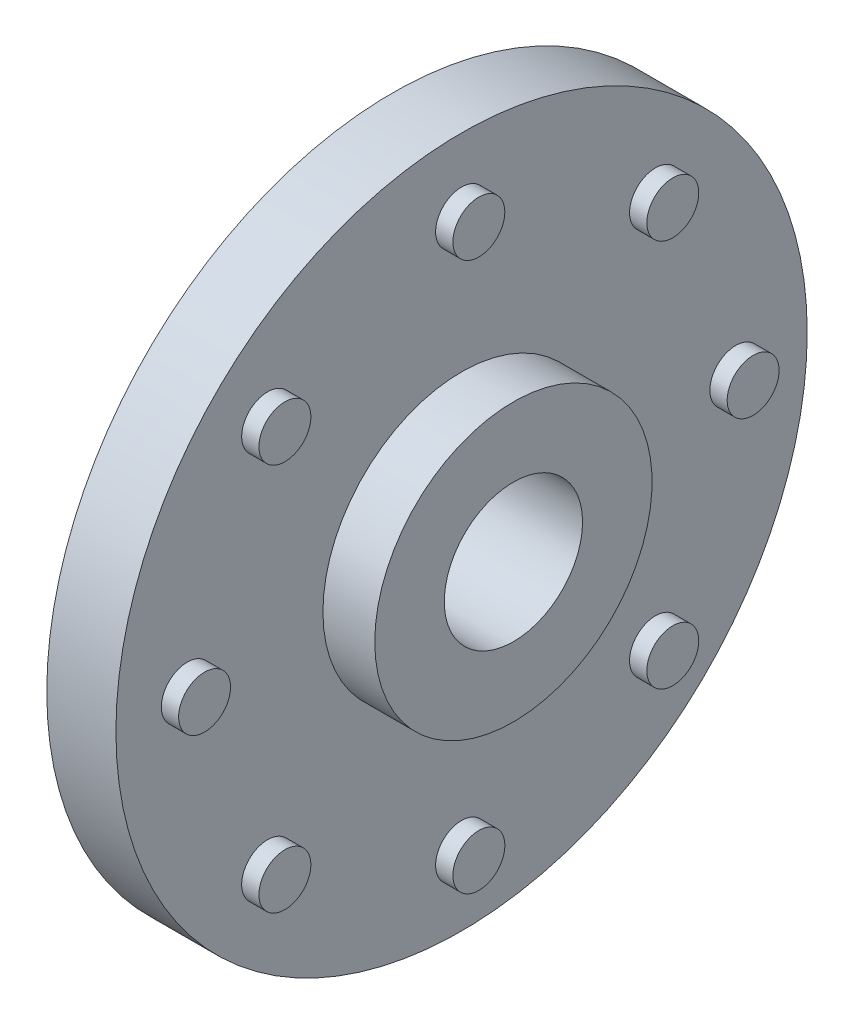
ISO-10303-21;
HEADER;
FILE_DESCRIPTION(('STEP AP214'),'2;1');
FILE_NAME('part.step','',(''),(''),'','','');
FILE_SCHEMA(('AUTOMOTIVE_DESIGN { 1 0 10303 214 1 1 1 1 }'));
ENDSEC;
DATA;
#1=APPLICATION_CONTEXT('core data for automotive mechanical design processes');
#2=APPLICATION_PROTOCOL_DEFINITION('international standard','automotive_design',2000,#1);
#3=PRODUCT_CONTEXT('',#1,'mechanical');
#4=PRODUCT('Part','Part','',(#3));
#5=PRODUCT_RELATED_PRODUCT_CATEGORY('part','',(#4));
#6=PRODUCT_DEFINITION_FORMATION('','',#4);
#7=PRODUCT_DEFINITION_CONTEXT('part definition',#1,'design');
#8=PRODUCT_DEFINITION('design','',#6,#7);
#9=PRODUCT_DEFINITION_SHAPE('','',#8);
#10=(LENGTH_UNIT() NAMED_UNIT(*) SI_UNIT(.MILLI.,.METRE.));
#11=(NAMED_UNIT(*) PLANE_ANGLE_UNIT() SI_UNIT($,.RADIAN.));
#12=(NAMED_UNIT(*) SI_UNIT($,.STERADIAN.) SOLID_ANGLE_UNIT());
#13=UNCERTAINTY_MEASURE_WITH_UNIT(LENGTH_MEASURE(1.E-05),#10,'distance_accuracy_value','');
#14=(GEOMETRIC_REPRESENTATION_CONTEXT(3) GLOBAL_UNCERTAINTY_ASSIGNED_CONTEXT((#13)) GLOBAL_UNIT_ASSIGNED_CONTEXT((#10,
#11,#12)) REPRESENTATION_CONTEXT('',''));
#15=CARTESIAN_POINT('',(0.,0.,0.));
#16=DIRECTION('',(0.,0.,1.));
#17=DIRECTION('',(1.,0.,0.));
#18=AXIS2_PLACEMENT_3D('',#15,#16,#17);
#19=CARTESIAN_POINT('',(25.4,0.,0.));
#20=DIRECTION('',(-1.,0.,0.));
#21=DIRECTION('',(0.,0.,1.));
#22=AXIS2_PLACEMENT_3D('',#19,#20,#21);
#23=CYLINDRICAL_SURFACE('',#22,127.);
#24=CARTESIAN_POINT('',(25.4,0.,0.));
#25=DIRECTION('',(1.,0.,0.));
#26=DIRECTION('',(0.,0.,-1.));
#27=AXIS2_PLACEMENT_3D('',#24,#25,#26);
#28=CIRCLE('',#27,127.);
#29=CARTESIAN_POINT('',(25.4,0.,-127.));
#30=VERTEX_POINT('',#29);
#31=EDGE_CURVE('E10',#30,#30,#28,.T.);
#32=ORIENTED_EDGE('',*,*,#31,.F.);
#33=EDGE_LOOP('',(#32));
#34=FACE_BOUND('',#33,.T.);
#35=CARTESIAN_POINT('',(0.,0.,0.));
#36=DIRECTION('',(1.,0.,0.));
#37=DIRECTION('',(0.,0.,-1.));
#38=AXIS2_PLACEMENT_3D('',#35,#36,#37);
#39=CIRCLE('',#38,127.);
#40=CARTESIAN_POINT('',(0.,0.,-127.));
#41=VERTEX_POINT('',#40);
#42=EDGE_CURVE('E42',#41,#41,#39,.T.);
#43=ORIENTED_EDGE('',*,*,#42,.T.);
#44=EDGE_LOOP('',(#43));
#45=FACE_BOUND('',#44,.T.);
#46=ADVANCED_FACE('F39',(#34,#45),#23,.T.);
#47=CARTESIAN_POINT('',(25.4,0.,0.));
#48=DIRECTION('',(1.,0.,0.));
#49=DIRECTION('',(0.,0.,-1.));
#50=AXIS2_PLACEMENT_3D('',#47,#48,#49);
#51=PLANE('',#50);
#52=CARTESIAN_POINT('',(25.4,0.,0.));
#53=DIRECTION('',(1.,0.,0.));
#54=DIRECTION('',(0.,0.,-1.));
#55=AXIS2_PLACEMENT_3D('',#52,#53,#54);
#56=CIRCLE('',#55,50.9441651055059);
#57=CARTESIAN_POINT('',(25.4,0.,50.9441651055059));
#58=VERTEX_POINT('',#57);
#59=EDGE_CURVE('E117',#58,#58,#56,.T.);
#60=ORIENTED_EDGE('',*,*,#59,.F.);
#61=EDGE_LOOP('',(#60));
#62=FACE_BOUND('',#61,.T.);
#63=CARTESIAN_POINT('',(25.4,70.6916974067853,-71.2605453901568));
#64=DIRECTION('',(1.,0.,0.));
#65=DIRECTION('',(0.,-0.707106781186539,-0.707106781186556));
#66=AXIS2_PLACEMENT_3D('',#63,#64,#65);
#67=CIRCLE('',#66,9.5415682804479);
#68=CARTESIAN_POINT('',(25.4,63.9447897725262,-78.007453024416));
#69=VERTEX_POINT('',#68);
#70=EDGE_CURVE('E109',#69,#69,#67,.T.);
#71=ORIENTED_EDGE('',*,*,#70,.F.);
#72=EDGE_LOOP('',(#71));
#73=FACE_BOUND('',#72,.T.);
#74=CARTESIAN_POINT('',(25.4,-0.568847983372097,-100.777629752864));
#75=DIRECTION('',(1.,0.,0.));
#76=DIRECTION('',(0.,-1.,0.));
#77=AXIS2_PLACEMENT_3D('',#74,#75,#76);
#78=CIRCLE('',#77,9.5415682804479);
#79=CARTESIAN_POINT('',(25.4,-10.11041626382,-100.777629752865));
#80=VERTEX_POINT('',#79);
#81=EDGE_CURVE('E101',#80,#80,#78,.T.);
#82=ORIENTED_EDGE('',*,*,#81,.F.);
#83=EDGE_LOOP('',(#82));
#84=FACE_BOUND('',#83,.T.);
#85=CARTESIAN_POINT('',(25.4,-71.8293933735302,-71.2605453901583));
#86=DIRECTION('',(1.,0.,0.));
#87=DIRECTION('',(0.,-0.707106781186554,0.707106781186541));
#88=AXIS2_PLACEMENT_3D('',#85,#86,#87);
#89=CIRCLE('',#88,9.5415682804479);
#90=CARTESIAN_POINT('',(25.4,-78.5763010077894,-64.5136377558992));
#91=VERTEX_POINT('',#90);
#92=EDGE_CURVE('E93',#91,#91,#89,.T.);
#93=ORIENTED_EDGE('',*,*,#92,.F.);
#94=EDGE_LOOP('',(#93));
#95=FACE_BOUND('',#94,.T.);
#96=CARTESIAN_POINT('',(25.4,-101.346477736238,0.));
#97=DIRECTION('',(1.,0.,0.));
#98=DIRECTION('',(0.,0.,1.));
#99=AXIS2_PLACEMENT_3D('',#96,#97,#98);
#100=CIRCLE('',#99,9.5415682804479);
#101=CARTESIAN_POINT('',(25.4,-101.346477736238,9.54156828044787));
#102=VERTEX_POINT('',#101);
#103=EDGE_CURVE('E85',#102,#102,#100,.T.);
#104=ORIENTED_EDGE('',*,*,#103,.F.);
#105=EDGE_LOOP('',(#104));
#106=FACE_BOUND('',#105,.T.);
#107=CARTESIAN_POINT('',(25.4,-71.8293933735312,71.2605453901572));
#108=DIRECTION('',(1.,0.,0.));
#109=DIRECTION('',(0.,0.707106781186544,0.707106781186551));
#110=AXIS2_PLACEMENT_3D('',#107,#108,#109);
#111=CIRCLE('',#110,9.5415682804479);
#112=CARTESIAN_POINT('',(25.4,-65.082485739272,78.0074530244164));
#113=VERTEX_POINT('',#112);
#114=EDGE_CURVE('E77',#113,#113,#111,.T.);
#115=ORIENTED_EDGE('',*,*,#114,.F.);
#116=EDGE_LOOP('',(#115));
#117=FACE_BOUND('',#116,.T.);
#118=CARTESIAN_POINT('',(25.4,-0.568847983373539,100.777629752864));
#119=DIRECTION('',(1.,0.,0.));
#120=DIRECTION('',(0.,1.,0.));
#121=AXIS2_PLACEMENT_3D('',#118,#119,#120);
#122=CIRCLE('',#121,9.5415682804479);
#123=CARTESIAN_POINT('',(25.4,8.97272029707437,100.777629752864));
#124=VERTEX_POINT('',#123);
#125=EDGE_CURVE('E69',#124,#124,#122,.T.);
#126=ORIENTED_EDGE('',*,*,#125,.F.);
#127=EDGE_LOOP('',(#126));
#128=FACE_BOUND('',#127,.T.);
#129=CARTESIAN_POINT('',(25.4,70.6916974067843,71.2605453901577));
#130=DIRECTION('',(1.,0.,0.));
#131=DIRECTION('',(0.,0.707106781186549,-0.707106781186546));
#132=AXIS2_PLACEMENT_3D('',#129,#130,#131);
#133=CIRCLE('',#132,9.5415682804479);
#134=CARTESIAN_POINT('',(25.4,77.4386050410435,64.5136377558986));
#135=VERTEX_POINT('',#134);
#136=EDGE_CURVE('E61',#135,#135,#133,.T.);
#137=ORIENTED_EDGE('',*,*,#136,.F.);
#138=EDGE_LOOP('',(#137));
#139=FACE_BOUND('',#138,.T.);
#140=CARTESIAN_POINT('',(25.4,100.208781769491,0.));
#141=DIRECTION('',(1.,0.,0.));
#142=DIRECTION('',(0.,0.,-1.));
#143=AXIS2_PLACEMENT_3D('',#140,#141,#142);
#144=CIRCLE('',#143,9.5415682804479);
#145=CARTESIAN_POINT('',(25.4,100.208781769491,-9.5415682804479));
#146=VERTEX_POINT('',#145);
#147=EDGE_CURVE('E53',#146,#146,#144,.T.);
#148=ORIENTED_EDGE('',*,*,#147,.F.);
#149=EDGE_LOOP('',(#148));
#150=FACE_BOUND('',#149,.T.);
#151=ORIENTED_EDGE('',*,*,#31,.T.);
#152=EDGE_LOOP('',(#151));
#153=FACE_BOUND('',#152,.T.);
#154=ADVANCED_FACE('F149',(#62,#73,#84,#95,#106,#117,#128,#139,#150,#153),#51,.T.);
#155=CARTESIAN_POINT('',(0.,0.,0.));
#156=DIRECTION('',(1.,0.,0.));
#157=DIRECTION('',(0.,0.,-1.));
#158=AXIS2_PLACEMENT_3D('',#155,#156,#157);
#159=PLANE('',#158);
#160=CARTESIAN_POINT('',(0.,0.,0.));
#161=DIRECTION('',(1.,0.,0.));
#162=DIRECTION('',(0.,0.,-1.));
#163=AXIS2_PLACEMENT_3D('',#160,#161,#162);
#164=CIRCLE('',#163,25.4);
#165=CARTESIAN_POINT('',(0.,0.,-25.4));
#166=VERTEX_POINT('',#165);
#167=EDGE_CURVE('E121',#166,#166,#164,.T.);
#168=ORIENTED_EDGE('',*,*,#167,.T.);
#169=EDGE_LOOP('',(#168));
#170=FACE_BOUND('',#169,.T.);
#171=ORIENTED_EDGE('',*,*,#42,.F.);
#172=EDGE_LOOP('',(#171));
#173=FACE_BOUND('',#172,.T.);
#174=ADVANCED_FACE('F152',(#170,#173),#159,.F.);
#175=CARTESIAN_POINT('',(31.75,100.208781769491,0.));
#176=DIRECTION('',(-1.,0.,0.));
#177=DIRECTION('',(0.,0.,1.));
#178=AXIS2_PLACEMENT_3D('',#175,#176,#177);
#179=CYLINDRICAL_SURFACE('',#178,9.5415682804479);
#180=CARTESIAN_POINT('',(31.75,100.208781769491,0.));
#181=DIRECTION('',(1.,0.,0.));
#182=DIRECTION('',(0.,0.,-1.));
#183=AXIS2_PLACEMENT_3D('',#180,#181,#182);
#184=CIRCLE('',#183,9.5415682804479);
#185=CARTESIAN_POINT('',(31.75,100.208781769491,-9.5415682804479));
#186=VERTEX_POINT('',#185);
#187=EDGE_CURVE('E51',#186,#186,#184,.T.);
#188=ORIENTED_EDGE('',*,*,#187,.F.);
#189=EDGE_LOOP('',(#188));
#190=FACE_BOUND('',#189,.T.);
#191=ORIENTED_EDGE('',*,*,#147,.T.);
#192=EDGE_LOOP('',(#191));
#193=FACE_BOUND('',#192,.T.);
#194=ADVANCED_FACE('F170',(#190,#193),#179,.T.);
#195=CARTESIAN_POINT('',(31.75,100.208781769491,0.));
#196=DIRECTION('',(1.,0.,0.));
#197=DIRECTION('',(0.,0.,-1.));
#198=AXIS2_PLACEMENT_3D('',#195,#196,#197);
#199=PLANE('',#198);
#200=ORIENTED_EDGE('',*,*,#187,.T.);
#201=EDGE_LOOP('',(#200));
#202=FACE_BOUND('',#201,.T.);
#203=ADVANCED_FACE('F172',(#202),#199,.T.);
#204=CARTESIAN_POINT('',(31.75,70.6916974067843,71.2605453901577));
#205=DIRECTION('',(-1.,0.,0.));
#206=DIRECTION('',(0.,0.,1.));
#207=AXIS2_PLACEMENT_3D('',#204,#205,#206);
#208=CYLINDRICAL_SURFACE('',#207,9.5415682804479);
#209=CARTESIAN_POINT('',(31.75,70.6916974067843,71.2605453901577));
#210=DIRECTION('',(1.,0.,0.));
#211=DIRECTION('',(0.,0.707106781186549,-0.707106781186546));
#212=AXIS2_PLACEMENT_3D('',#209,#210,#211);
#213=CIRCLE('',#212,9.5415682804479);
#214=CARTESIAN_POINT('',(31.75,77.4386050410435,64.5136377558986));
#215=VERTEX_POINT('',#214);
#216=EDGE_CURVE('E57',#215,#215,#213,.T.);
#217=ORIENTED_EDGE('',*,*,#216,.F.);
#218=EDGE_LOOP('',(#217));
#219=FACE_BOUND('',#218,.T.);
#220=ORIENTED_EDGE('',*,*,#136,.T.);
#221=EDGE_LOOP('',(#220));
#222=FACE_BOUND('',#221,.T.);
#223=ADVANCED_FACE('F179',(#219,#222),#208,.T.);
#224=CARTESIAN_POINT('',(31.75,70.6916974067843,71.2605453901577));
#225=DIRECTION('',(1.,0.,0.));
#226=DIRECTION('',(0.,0.707106781186549,-0.707106781186546));
#227=AXIS2_PLACEMENT_3D('',#224,#225,#226);
#228=PLANE('',#227);
#229=ORIENTED_EDGE('',*,*,#216,.T.);
#230=EDGE_LOOP('',(#229));
#231=FACE_BOUND('',#230,.T.);
#232=ADVANCED_FACE('F269',(#231),#228,.T.);
#233=CARTESIAN_POINT('',(31.75,-0.568847983373539,100.777629752864));
#234=DIRECTION('',(-1.,0.,0.));
#235=DIRECTION('',(0.,0.,1.));
#236=AXIS2_PLACEMENT_3D('',#233,#234,#235);
#237=CYLINDRICAL_SURFACE('',#236,9.5415682804479);
#238=CARTESIAN_POINT('',(31.75,-0.568847983373539,100.777629752864));
#239=DIRECTION('',(1.,0.,0.));
#240=DIRECTION('',(0.,1.,0.));
#241=AXIS2_PLACEMENT_3D('',#238,#239,#240);
#242=CIRCLE('',#241,9.5415682804479);
#243=CARTESIAN_POINT('',(31.75,8.97272029707437,100.777629752864));
#244=VERTEX_POINT('',#243);
#245=EDGE_CURVE('E65',#244,#244,#242,.T.);
#246=ORIENTED_EDGE('',*,*,#245,.F.);
#247=EDGE_LOOP('',(#246));
#248=FACE_BOUND('',#247,.T.);
#249=ORIENTED_EDGE('',*,*,#125,.T.);
#250=EDGE_LOOP('',(#249));
#251=FACE_BOUND('',#250,.T.);
#252=ADVANCED_FACE('F265',(#248,#251),#237,.T.);
#253=CARTESIAN_POINT('',(31.75,-0.568847983373539,100.777629752864));
#254=DIRECTION('',(1.,0.,0.));
#255=DIRECTION('',(0.,1.,0.));
#256=AXIS2_PLACEMENT_3D('',#253,#254,#255);
#257=PLANE('',#256);
#258=ORIENTED_EDGE('',*,*,#245,.T.);
#259=EDGE_LOOP('',(#258));
#260=FACE_BOUND('',#259,.T.);
#261=ADVANCED_FACE('F261',(#260),#257,.T.);
#262=CARTESIAN_POINT('',(31.75,-71.8293933735312,71.2605453901572));
#263=DIRECTION('',(-1.,0.,0.));
#264=DIRECTION('',(0.,0.,1.));
#265=AXIS2_PLACEMENT_3D('',#262,#263,#264);
#266=CYLINDRICAL_SURFACE('',#265,9.5415682804479);
#267=CARTESIAN_POINT('',(31.75,-71.8293933735312,71.2605453901572));
#268=DIRECTION('',(1.,0.,0.));
#269=DIRECTION('',(0.,0.707106781186544,0.707106781186551));
#270=AXIS2_PLACEMENT_3D('',#267,#268,#269);
#271=CIRCLE('',#270,9.5415682804479);
#272=CARTESIAN_POINT('',(31.75,-65.082485739272,78.0074530244164));
#273=VERTEX_POINT('',#272);
#274=EDGE_CURVE('E73',#273,#273,#271,.T.);
#275=ORIENTED_EDGE('',*,*,#274,.F.);
#276=EDGE_LOOP('',(#275));
#277=FACE_BOUND('',#276,.T.);
#278=ORIENTED_EDGE('',*,*,#114,.T.);
#279=EDGE_LOOP('',(#278));
#280=FACE_BOUND('',#279,.T.);
#281=ADVANCED_FACE('F257',(#277,#280),#266,.T.);
#282=CARTESIAN_POINT('',(31.75,-71.8293933735312,71.2605453901572));
#283=DIRECTION('',(1.,0.,0.));
#284=DIRECTION('',(0.,0.707106781186544,0.707106781186551));
#285=AXIS2_PLACEMENT_3D('',#282,#283,#284);
#286=PLANE('',#285);
#287=ORIENTED_EDGE('',*,*,#274,.T.);
#288=EDGE_LOOP('',(#287));
#289=FACE_BOUND('',#288,.T.);
#290=ADVANCED_FACE('F253',(#289),#286,.T.);
#291=CARTESIAN_POINT('',(31.75,-101.346477736238,0.));
#292=DIRECTION('',(-1.,0.,0.));
#293=DIRECTION('',(0.,0.,1.));
#294=AXIS2_PLACEMENT_3D('',#291,#292,#293);
#295=CYLINDRICAL_SURFACE('',#294,9.5415682804479);
#296=CARTESIAN_POINT('',(31.75,-101.346477736238,0.));
#297=DIRECTION('',(1.,0.,0.));
#298=DIRECTION('',(0.,0.,1.));
#299=AXIS2_PLACEMENT_3D('',#296,#297,#298);
#300=CIRCLE('',#299,9.5415682804479);
#301=CARTESIAN_POINT('',(31.75,-101.346477736238,9.54156828044787));
#302=VERTEX_POINT('',#301);
#303=EDGE_CURVE('E81',#302,#302,#300,.T.);
#304=ORIENTED_EDGE('',*,*,#303,.F.);
#305=EDGE_LOOP('',(#304));
#306=FACE_BOUND('',#305,.T.);
#307=ORIENTED_EDGE('',*,*,#103,.T.);
#308=EDGE_LOOP('',(#307));
#309=FACE_BOUND('',#308,.T.);
#310=ADVANCED_FACE('F249',(#306,#309),#295,.T.);
#311=CARTESIAN_POINT('',(31.75,-101.346477736238,0.));
#312=DIRECTION('',(1.,0.,0.));
#313=DIRECTION('',(0.,0.,1.));
#314=AXIS2_PLACEMENT_3D('',#311,#312,#313);
#315=PLANE('',#314);
#316=ORIENTED_EDGE('',*,*,#303,.T.);
#317=EDGE_LOOP('',(#316));
#318=FACE_BOUND('',#317,.T.);
#319=ADVANCED_FACE('F245',(#318),#315,.T.);
#320=CARTESIAN_POINT('',(31.75,-71.8293933735302,-71.2605453901583));
#321=DIRECTION('',(-1.,0.,0.));
#322=DIRECTION('',(0.,0.,1.));
#323=AXIS2_PLACEMENT_3D('',#320,#321,#322);
#324=CYLINDRICAL_SURFACE('',#323,9.5415682804479);
#325=CARTESIAN_POINT('',(31.75,-71.8293933735302,-71.2605453901583));
#326=DIRECTION('',(1.,0.,0.));
#327=DIRECTION('',(0.,-0.707106781186554,0.707106781186541));
#328=AXIS2_PLACEMENT_3D('',#325,#326,#327);
#329=CIRCLE('',#328,9.5415682804479);
#330=CARTESIAN_POINT('',(31.75,-78.5763010077894,-64.5136377558992));
#331=VERTEX_POINT('',#330);
#332=EDGE_CURVE('E89',#331,#331,#329,.T.);
#333=ORIENTED_EDGE('',*,*,#332,.F.);
#334=EDGE_LOOP('',(#333));
#335=FACE_BOUND('',#334,.T.);
#336=ORIENTED_EDGE('',*,*,#92,.T.);
#337=EDGE_LOOP('',(#336));
#338=FACE_BOUND('',#337,.T.);
#339=ADVANCED_FACE('F241',(#335,#338),#324,.T.);
#340=CARTESIAN_POINT('',(31.75,-71.8293933735302,-71.2605453901583));
#341=DIRECTION('',(1.,0.,0.));
#342=DIRECTION('',(0.,-0.707106781186554,0.707106781186541));
#343=AXIS2_PLACEMENT_3D('',#340,#341,#342);
#344=PLANE('',#343);
#345=ORIENTED_EDGE('',*,*,#332,.T.);
#346=EDGE_LOOP('',(#345));
#347=FACE_BOUND('',#346,.T.);
#348=ADVANCED_FACE('F237',(#347),#344,.T.);
#349=CARTESIAN_POINT('',(31.75,-0.568847983372097,-100.777629752864));
#350=DIRECTION('',(-1.,0.,0.));
#351=DIRECTION('',(0.,0.,1.));
#352=AXIS2_PLACEMENT_3D('',#349,#350,#351);
#353=CYLINDRICAL_SURFACE('',#352,9.5415682804479);
#354=CARTESIAN_POINT('',(31.75,-0.568847983372097,-100.777629752864));
#355=DIRECTION('',(1.,0.,0.));
#356=DIRECTION('',(0.,-1.,0.));
#357=AXIS2_PLACEMENT_3D('',#354,#355,#356);
#358=CIRCLE('',#357,9.5415682804479);
#359=CARTESIAN_POINT('',(31.75,-10.11041626382,-100.777629752865));
#360=VERTEX_POINT('',#359);
#361=EDGE_CURVE('E97',#360,#360,#358,.T.);
#362=ORIENTED_EDGE('',*,*,#361,.F.);
#363=EDGE_LOOP('',(#362));
#364=FACE_BOUND('',#363,.T.);
#365=ORIENTED_EDGE('',*,*,#81,.T.);
#366=EDGE_LOOP('',(#365));
#367=FACE_BOUND('',#366,.T.);
#368=ADVANCED_FACE('F233',(#364,#367),#353,.T.);
#369=CARTESIAN_POINT('',(31.75,-0.568847983372097,-100.777629752864));
#370=DIRECTION('',(1.,0.,0.));
#371=DIRECTION('',(0.,-1.,0.));
#372=AXIS2_PLACEMENT_3D('',#369,#370,#371);
#373=PLANE('',#372);
#374=ORIENTED_EDGE('',*,*,#361,.T.);
#375=EDGE_LOOP('',(#374));
#376=FACE_BOUND('',#375,.T.);
#377=ADVANCED_FACE('F229',(#376),#373,.T.);
#378=CARTESIAN_POINT('',(31.75,70.6916974067853,-71.2605453901568));
#379=DIRECTION('',(-1.,0.,0.));
#380=DIRECTION('',(0.,0.,1.));
#381=AXIS2_PLACEMENT_3D('',#378,#379,#380);
#382=CYLINDRICAL_SURFACE('',#381,9.5415682804479);
#383=CARTESIAN_POINT('',(31.75,70.6916974067853,-71.2605453901568));
#384=DIRECTION('',(1.,0.,0.));
#385=DIRECTION('',(0.,-0.707106781186539,-0.707106781186556));
#386=AXIS2_PLACEMENT_3D('',#383,#384,#385);
#387=CIRCLE('',#386,9.5415682804479);
#388=CARTESIAN_POINT('',(31.75,63.9447897725262,-78.007453024416));
#389=VERTEX_POINT('',#388);
#390=EDGE_CURVE('E105',#389,#389,#387,.T.);
#391=ORIENTED_EDGE('',*,*,#390,.F.);
#392=EDGE_LOOP('',(#391));
#393=FACE_BOUND('',#392,.T.);
#394=ORIENTED_EDGE('',*,*,#70,.T.);
#395=EDGE_LOOP('',(#394));
#396=FACE_BOUND('',#395,.T.);
#397=ADVANCED_FACE('F225',(#393,#396),#382,.T.);
#398=CARTESIAN_POINT('',(31.75,70.6916974067853,-71.2605453901568));
#399=DIRECTION('',(1.,0.,0.));
#400=DIRECTION('',(0.,-0.707106781186539,-0.707106781186556));
#401=AXIS2_PLACEMENT_3D('',#398,#399,#400);
#402=PLANE('',#401);
#403=ORIENTED_EDGE('',*,*,#390,.T.);
#404=EDGE_LOOP('',(#403));
#405=FACE_BOUND('',#404,.T.);
#406=ADVANCED_FACE('F145',(#405),#402,.T.);
#407=CARTESIAN_POINT('',(44.45,0.,0.));
#408=DIRECTION('',(-1.,0.,0.));
#409=DIRECTION('',(0.,0.,1.));
#410=AXIS2_PLACEMENT_3D('',#407,#408,#409);
#411=CYLINDRICAL_SURFACE('',#410,50.9441651055059);
#412=CARTESIAN_POINT('',(44.45,0.,0.));
#413=DIRECTION('',(1.,0.,0.));
#414=DIRECTION('',(0.,0.,-1.));
#415=AXIS2_PLACEMENT_3D('',#412,#413,#414);
#416=CIRCLE('',#415,50.9441651055059);
#417=CARTESIAN_POINT('',(44.45,0.,50.9441651055059));
#418=VERTEX_POINT('',#417);
#419=EDGE_CURVE('E113',#418,#418,#416,.T.);
#420=CARTESIAN_POINT('',(44.45,0.,50.9441651055059));
#421=CARTESIAN_POINT('',(44.2515625,0.,50.9441651055059));
#422=CARTESIAN_POINT('',(44.053125,0.,50.9441651055059));
#423=CARTESIAN_POINT('',(43.65625,0.,50.9441651055059));
#424=CARTESIAN_POINT('',(43.4578125,0.,50.9441651055059));
#425=CARTESIAN_POINT('',(43.0609375,0.,50.9441651055059));
#426=CARTESIAN_POINT('',(42.8625,0.,50.9441651055059));
#427=CARTESIAN_POINT('',(42.465625,0.,50.9441651055059));
#428=CARTESIAN_POINT('',(42.2671875,0.,50.9441651055059));
#429=CARTESIAN_POINT('',(41.8703125,0.,50.9441651055059));
#430=CARTESIAN_POINT('',(41.671875,0.,50.9441651055059));
#431=CARTESIAN_POINT('',(41.275,0.,50.9441651055059));
#432=CARTESIAN_POINT('',(41.0765625,0.,50.9441651055059));
#433=CARTESIAN_POINT('',(40.6796875,0.,50.9441651055059));
#434=CARTESIAN_POINT('',(40.48125,0.,50.9441651055059));
#435=CARTESIAN_POINT('',(40.084375,0.,50.9441651055059));
#436=CARTESIAN_POINT('',(39.8859375,0.,50.9441651055059));
#437=CARTESIAN_POINT('',(39.4890625,0.,50.9441651055059));
#438=CARTESIAN_POINT('',(39.290625,0.,50.9441651055059));
#439=CARTESIAN_POINT('',(38.89375,0.,50.9441651055059));
#440=CARTESIAN_POINT('',(38.6953125,0.,50.9441651055059));
#441=CARTESIAN_POINT('',(38.2984375,0.,50.9441651055059));
#442=CARTESIAN_POINT('',(38.1,0.,50.9441651055059));
#443=CARTESIAN_POINT('',(37.703125,0.,50.9441651055059));
#444=CARTESIAN_POINT('',(37.5046875,0.,50.9441651055059));
#445=CARTESIAN_POINT('',(37.1078125,0.,50.9441651055059));
#446=CARTESIAN_POINT('',(36.909375,0.,50.9441651055059));
#447=CARTESIAN_POINT('',(36.5125,0.,50.9441651055059));
#448=CARTESIAN_POINT('',(36.3140625,0.,50.9441651055059));
#449=CARTESIAN_POINT('',(35.9171875,0.,50.9441651055059));
#450=CARTESIAN_POINT('',(35.71875,0.,50.9441651055059));
#451=CARTESIAN_POINT('',(35.321875,0.,50.9441651055059));
#452=CARTESIAN_POINT('',(35.1234375,0.,50.9441651055059));
#453=CARTESIAN_POINT('',(34.7265625,0.,50.9441651055059));
#454=CARTESIAN_POINT('',(34.528125,0.,50.9441651055059));
#455=CARTESIAN_POINT('',(34.13125,0.,50.9441651055059));
#456=CARTESIAN_POINT('',(33.9328125,0.,50.9441651055059));
#457=CARTESIAN_POINT('',(33.5359375,0.,50.9441651055059));
#458=CARTESIAN_POINT('',(33.3375,0.,50.9441651055059));
#459=CARTESIAN_POINT('',(32.940625,0.,50.9441651055059));
#460=CARTESIAN_POINT('',(32.7421875,0.,50.9441651055059));
#461=CARTESIAN_POINT('',(32.3453125,0.,50.9441651055059));
#462=CARTESIAN_POINT('',(32.146875,0.,50.9441651055059));
#463=CARTESIAN_POINT('',(31.75,0.,50.9441651055059));
#464=CARTESIAN_POINT('',(31.5515625,0.,50.9441651055059));
#465=CARTESIAN_POINT('',(31.1546875,0.,50.9441651055059));
#466=CARTESIAN_POINT('',(30.95625,0.,50.9441651055059));
#467=CARTESIAN_POINT('',(30.559375,0.,50.9441651055059));
#468=CARTESIAN_POINT('',(30.3609375,0.,50.9441651055059));
#469=CARTESIAN_POINT('',(29.9640625,0.,50.9441651055059));
#470=CARTESIAN_POINT('',(29.765625,0.,50.9441651055059));
#471=CARTESIAN_POINT('',(29.36875,0.,50.9441651055059));
#472=CARTESIAN_POINT('',(29.1703125,0.,50.9441651055059));
#473=CARTESIAN_POINT('',(28.7734375,0.,50.9441651055059));
#474=CARTESIAN_POINT('',(28.575,0.,50.9441651055059));
#475=CARTESIAN_POINT('',(28.178125,0.,50.9441651055059));
#476=CARTESIAN_POINT('',(27.9796875,0.,50.9441651055059));
#477=CARTESIAN_POINT('',(27.5828125,0.,50.9441651055059));
#478=CARTESIAN_POINT('',(27.384375,0.,50.9441651055059));
#479=CARTESIAN_POINT('',(26.9875,0.,50.9441651055059));
#480=CARTESIAN_POINT('',(26.7890625,0.,50.9441651055059));
#481=CARTESIAN_POINT('',(26.3921875,0.,50.9441651055059));
#482=CARTESIAN_POINT('',(26.19375,0.,50.9441651055059));
#483=CARTESIAN_POINT('',(25.796875,0.,50.9441651055059));
#484=CARTESIAN_POINT('',(25.5984375,0.,50.9441651055059));
#485=CARTESIAN_POINT('',(25.4,0.,50.9441651055059));
#486=B_SPLINE_CURVE_WITH_KNOTS('',3,(#420,#421,#422,#423,#424,#425,#426,#427,#428,#429,#430,
#431,#432,#433,#434,#435,#436,#437,#438,#439,#440,#441,#442,#443,#444,#445,#446,#447,#448,#449,
#450,#451,#452,#453,#454,#455,#456,#457,#458,#459,#460,#461,#462,#463,#464,#465,#466,#467,#468,
#469,#470,#471,#472,#473,#474,#475,#476,#477,#478,#479,#480,#481,#482,#483,#484,#485),
.UNSPECIFIED.,.F.,.F.,(4,2,2,2,2,2,2,2,2,2,2,2,2,2,2,2,2,2,2,2,2,2,2,2,2,2,2,2,2,2,2,2,4),(0.,
0.595312499999993,1.19062499999999,1.78593749999999,2.38124999999999,2.97656249999999,3.571875,
4.1671875,4.7625,5.3578125,5.953125,6.5484375,7.14375,7.7390625,8.334375,8.9296875,9.525,
10.1203125,10.715625,11.3109375,11.90625,12.5015625,13.096875,13.6921875,14.2875,14.8828125,
15.478125,16.0734375,16.66875,17.2640625,17.859375,18.4546875,19.05),.UNSPECIFIED.);
#487=EDGE_CURVE('BSEAM139',#418,#58,#486,.T.);
#488=ORIENTED_EDGE('',*,*,#419,.F.);
#489=ORIENTED_EDGE('',*,*,#59,.T.);
#490=ORIENTED_EDGE('',*,*,#487,.T.);
#491=ORIENTED_EDGE('',*,*,#487,.F.);
#492=EDGE_LOOP('',(#488,#490,#489,#491));
#493=FACE_BOUND('',#492,.T.);
#494=ADVANCED_FACE('F139',(#493),#411,.T.);
#495=CARTESIAN_POINT('',(44.45,0.,0.));
#496=DIRECTION('',(1.,0.,0.));
#497=DIRECTION('',(0.,0.,-1.));
#498=AXIS2_PLACEMENT_3D('',#495,#496,#497);
#499=PLANE('',#498);
#500=CARTESIAN_POINT('',(44.45,0.,0.));
#501=DIRECTION('',(1.,0.,0.));
#502=DIRECTION('',(0.,0.,-1.));
#503=AXIS2_PLACEMENT_3D('',#500,#501,#502);
#504=CIRCLE('',#503,25.4);
#505=CARTESIAN_POINT('',(44.45,0.,-25.4));
#506=VERTEX_POINT('',#505);
#507=EDGE_CURVE('E128',#506,#506,#504,.T.);
#508=ORIENTED_EDGE('',*,*,#507,.F.);
#509=EDGE_LOOP('',(#508));
#510=FACE_BOUND('',#509,.T.);
#511=ORIENTED_EDGE('',*,*,#419,.T.);
#512=EDGE_LOOP('',(#511));
#513=FACE_BOUND('',#512,.T.);
#514=ADVANCED_FACE('F136',(#510,#513),#499,.T.);
#515=CARTESIAN_POINT('',(-87.884,0.,0.));
#516=DIRECTION('',(1.,0.,0.));
#517=DIRECTION('',(0.,0.,-1.));
#518=AXIS2_PLACEMENT_3D('',#515,#516,#517);
#519=CYLINDRICAL_SURFACE('',#518,25.4);
#520=ORIENTED_EDGE('',*,*,#507,.T.);
#521=EDGE_LOOP('',(#520));
#522=FACE_BOUND('',#521,.T.);
#523=ORIENTED_EDGE('',*,*,#167,.F.);
#524=EDGE_LOOP('',(#523));
#525=FACE_BOUND('',#524,.T.);
#526=ADVANCED_FACE('F133',(#522,#525),#519,.F.);
#527=CLOSED_SHELL('',(#46,#154,#174,#194,#203,#223,#232,#252,#261,#281,#290,#310,#319,#339,#348,
#368,#377,#397,#406,#494,#514,#526));
#528=MANIFOLD_SOLID_BREP('B2',#527);
#529=ADVANCED_BREP_SHAPE_REPRESENTATION('',(#18,#528),#14);
#530=SHAPE_DEFINITION_REPRESENTATION(#9,#529);
ENDSEC;
END-ISO-10303-21;
